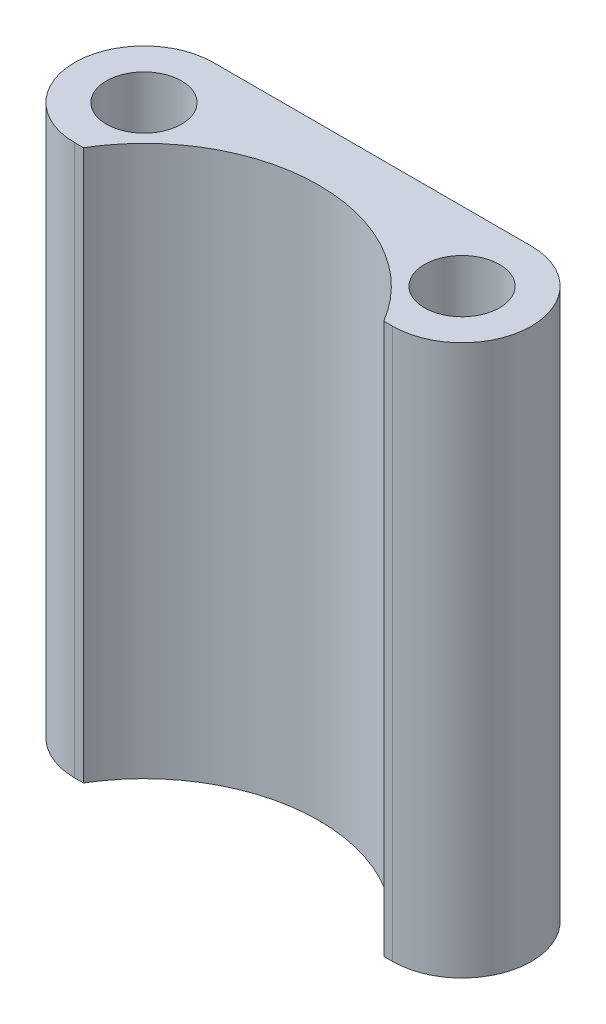
ISO-10303-21;
HEADER;
FILE_DESCRIPTION(('STEP AP214'),'2;1');
FILE_NAME('part.step','',(''),(''),'','','');
FILE_SCHEMA(('AUTOMOTIVE_DESIGN { 1 0 10303 214 1 1 1 1 }'));
ENDSEC;
DATA;
#1=APPLICATION_CONTEXT('core data for automotive mechanical design processes');
#2=APPLICATION_PROTOCOL_DEFINITION('international standard','automotive_design',2000,#1);
#3=PRODUCT_CONTEXT('',#1,'mechanical');
#4=PRODUCT('Part','Part','',(#3));
#5=PRODUCT_RELATED_PRODUCT_CATEGORY('part','',(#4));
#6=PRODUCT_DEFINITION_FORMATION('','',#4);
#7=PRODUCT_DEFINITION_CONTEXT('part definition',#1,'design');
#8=PRODUCT_DEFINITION('design','',#6,#7);
#9=PRODUCT_DEFINITION_SHAPE('','',#8);
#10=(LENGTH_UNIT() NAMED_UNIT(*) SI_UNIT(.MILLI.,.METRE.));
#11=(NAMED_UNIT(*) PLANE_ANGLE_UNIT() SI_UNIT($,.RADIAN.));
#12=(NAMED_UNIT(*) SI_UNIT($,.STERADIAN.) SOLID_ANGLE_UNIT());
#13=UNCERTAINTY_MEASURE_WITH_UNIT(LENGTH_MEASURE(1.E-05),#10,'distance_accuracy_value','');
#14=(GEOMETRIC_REPRESENTATION_CONTEXT(3) GLOBAL_UNCERTAINTY_ASSIGNED_CONTEXT((#13)) GLOBAL_UNIT_ASSIGNED_CONTEXT((#10,
#11,#12)) REPRESENTATION_CONTEXT('',''));
#15=CARTESIAN_POINT('',(0.,0.,0.));
#16=DIRECTION('',(0.,0.,1.));
#17=DIRECTION('',(1.,0.,0.));
#18=AXIS2_PLACEMENT_3D('',#15,#16,#17);
#19=CARTESIAN_POINT('',(0.,43.942,5.54));
#20=DIRECTION('',(0.,0.,-1.));
#21=DIRECTION('',(-1.,0.,0.));
#22=AXIS2_PLACEMENT_3D('',#19,#20,#21);
#23=PLANE('',#22);
#24=DIRECTION('',(1.,0.,0.));
#25=VECTOR('',#24,1.);
#26=CARTESIAN_POINT('',(0.,0.,5.54));
#27=LINE('',#26,#25);
#28=CARTESIAN_POINT('',(-12.7,0.,5.54));
#29=VERTEX_POINT('',#28);
#30=CARTESIAN_POINT('',(-11.9956367066318,0.,5.54));
#31=VERTEX_POINT('',#30);
#32=EDGE_CURVE('E129',#29,#31,#27,.T.);
#33=ORIENTED_EDGE('',*,*,#32,.T.);
#34=DIRECTION('',(0.,-1.,0.));
#35=VECTOR('',#34,1.);
#36=CARTESIAN_POINT('',(-11.9956367066318,43.942,5.54));
#37=LINE('',#36,#35);
#38=CARTESIAN_POINT('',(-11.9956367066318,43.942,5.54));
#39=VERTEX_POINT('',#38);
#40=EDGE_CURVE('E11',#39,#31,#37,.T.);
#41=ORIENTED_EDGE('',*,*,#40,.F.);
#42=DIRECTION('',(1.,0.,0.));
#43=VECTOR('',#42,1.);
#44=CARTESIAN_POINT('',(0.,43.942,5.54));
#45=LINE('',#44,#43);
#46=CARTESIAN_POINT('',(-12.7,43.942,5.54));
#47=VERTEX_POINT('',#46);
#48=EDGE_CURVE('E86',#47,#39,#45,.T.);
#49=ORIENTED_EDGE('',*,*,#48,.F.);
#50=DIRECTION('',(0.,-1.,0.));
#51=VECTOR('',#50,1.);
#52=CARTESIAN_POINT('',(-12.7,43.942,5.54));
#53=LINE('',#52,#51);
#54=EDGE_CURVE('E128',#47,#29,#53,.T.);
#55=ORIENTED_EDGE('',*,*,#54,.T.);
#56=EDGE_LOOP('',(#33,#41,#49,#55));
#57=FACE_BOUND('',#56,.T.);
#58=ADVANCED_FACE('F39',(#57),#23,.F.);
#59=CARTESIAN_POINT('',(1.044590437643E-10,43.942,12.7000000000001));
#60=DIRECTION('',(0.,-1.,0.));
#61=DIRECTION('',(0.,0.,-1.));
#62=AXIS2_PLACEMENT_3D('',#59,#60,#61);
#63=CYLINDRICAL_SURFACE('',#62,13.97);
#64=CARTESIAN_POINT('',(1.044590437643E-10,0.,12.7000000000001));
#65=DIRECTION('',(0.,1.,0.));
#66=DIRECTION('',(0.,0.,1.));
#67=AXIS2_PLACEMENT_3D('',#64,#65,#66);
#68=CIRCLE('',#67,13.97);
#69=CARTESIAN_POINT('',(11.9956367068407,0.,5.54));
#70=VERTEX_POINT('',#69);
#71=EDGE_CURVE('E132',#70,#31,#68,.T.);
#72=ORIENTED_EDGE('',*,*,#71,.F.);
#73=DIRECTION('',(0.,-1.,0.));
#74=VECTOR('',#73,1.);
#75=CARTESIAN_POINT('',(11.9956367068407,43.942,5.54));
#76=LINE('',#75,#74);
#77=CARTESIAN_POINT('',(11.9956367068407,43.942,5.54));
#78=VERTEX_POINT('',#77);
#79=EDGE_CURVE('E48',#78,#70,#76,.T.);
#80=ORIENTED_EDGE('',*,*,#79,.F.);
#81=CARTESIAN_POINT('',(1.044590437643E-10,43.942,12.7000000000001));
#82=DIRECTION('',(0.,1.,0.));
#83=DIRECTION('',(0.,0.,1.));
#84=AXIS2_PLACEMENT_3D('',#81,#82,#83);
#85=CIRCLE('',#84,13.97);
#86=EDGE_CURVE('E158',#78,#39,#85,.T.);
#87=ORIENTED_EDGE('',*,*,#86,.T.);
#88=ORIENTED_EDGE('',*,*,#40,.T.);
#89=EDGE_LOOP('',(#72,#80,#87,#88));
#90=FACE_BOUND('',#89,.T.);
#91=ADVANCED_FACE('F41',(#90),#63,.F.);
#92=CARTESIAN_POINT('',(12.7,0.,5.54));
#93=VERTEX_POINT('',#92);
#94=EDGE_CURVE('E133',#70,#93,#27,.T.);
#95=ORIENTED_EDGE('',*,*,#94,.T.);
#96=DIRECTION('',(0.,-1.,0.));
#97=VECTOR('',#96,1.);
#98=CARTESIAN_POINT('',(12.7,43.942,5.54));
#99=LINE('',#98,#97);
#100=CARTESIAN_POINT('',(12.7,43.942,5.54));
#101=VERTEX_POINT('',#100);
#102=EDGE_CURVE('E115',#101,#93,#99,.T.);
#103=ORIENTED_EDGE('',*,*,#102,.F.);
#104=EDGE_CURVE('E102',#78,#101,#45,.T.);
#105=ORIENTED_EDGE('',*,*,#104,.F.);
#106=ORIENTED_EDGE('',*,*,#79,.T.);
#107=EDGE_LOOP('',(#95,#103,#105,#106));
#108=FACE_BOUND('',#107,.T.);
#109=ADVANCED_FACE('F150',(#108),#23,.F.);
#110=CARTESIAN_POINT('',(12.7,43.942,0.));
#111=DIRECTION('',(0.,-1.,0.));
#112=DIRECTION('',(0.,0.,-1.));
#113=AXIS2_PLACEMENT_3D('',#110,#111,#112);
#114=CYLINDRICAL_SURFACE('',#113,5.54);
#115=CARTESIAN_POINT('',(12.7,0.,0.));
#116=DIRECTION('',(0.,1.,0.));
#117=DIRECTION('',(0.,0.,1.));
#118=AXIS2_PLACEMENT_3D('',#115,#116,#117);
#119=CIRCLE('',#118,5.54);
#120=CARTESIAN_POINT('',(12.7,0.,-5.54000000000001));
#121=VERTEX_POINT('',#120);
#122=EDGE_CURVE('E111',#93,#121,#119,.T.);
#123=ORIENTED_EDGE('',*,*,#122,.T.);
#124=DIRECTION('',(0.,-1.,0.));
#125=VECTOR('',#124,1.);
#126=CARTESIAN_POINT('',(12.7,43.942,-5.54000000000001));
#127=LINE('',#126,#125);
#128=CARTESIAN_POINT('',(12.7,43.942,-5.54000000000001));
#129=VERTEX_POINT('',#128);
#130=EDGE_CURVE('E108',#129,#121,#127,.T.);
#131=ORIENTED_EDGE('',*,*,#130,.F.);
#132=CARTESIAN_POINT('',(12.7,43.942,0.));
#133=DIRECTION('',(0.,1.,0.));
#134=DIRECTION('',(0.,0.,1.));
#135=AXIS2_PLACEMENT_3D('',#132,#133,#134);
#136=CIRCLE('',#135,5.54);
#137=EDGE_CURVE('E95',#101,#129,#136,.T.);
#138=ORIENTED_EDGE('',*,*,#137,.F.);
#139=ORIENTED_EDGE('',*,*,#102,.T.);
#140=EDGE_LOOP('',(#123,#131,#138,#139));
#141=FACE_BOUND('',#140,.T.);
#142=ADVANCED_FACE('F109',(#141),#114,.T.);
#143=CARTESIAN_POINT('',(0.,43.942,-5.54000000000001));
#144=DIRECTION('',(0.,0.,-1.));
#145=DIRECTION('',(-1.,0.,0.));
#146=AXIS2_PLACEMENT_3D('',#143,#144,#145);
#147=PLANE('',#146);
#148=DIRECTION('',(1.,0.,0.));
#149=VECTOR('',#148,1.);
#150=CARTESIAN_POINT('',(0.,0.,-5.54000000000001));
#151=LINE('',#150,#149);
#152=CARTESIAN_POINT('',(-12.7,0.,-5.54));
#153=VERTEX_POINT('',#152);
#154=EDGE_CURVE('E137',#153,#121,#151,.T.);
#155=ORIENTED_EDGE('',*,*,#154,.F.);
#156=DIRECTION('',(0.,-1.,0.));
#157=VECTOR('',#156,1.);
#158=CARTESIAN_POINT('',(-12.7,43.942,-5.54));
#159=LINE('',#158,#157);
#160=CARTESIAN_POINT('',(-12.7,43.942,-5.54));
#161=VERTEX_POINT('',#160);
#162=EDGE_CURVE('E77',#161,#153,#159,.T.);
#163=ORIENTED_EDGE('',*,*,#162,.F.);
#164=DIRECTION('',(1.,0.,0.));
#165=VECTOR('',#164,1.);
#166=CARTESIAN_POINT('',(0.,43.942,-5.54000000000001));
#167=LINE('',#166,#165);
#168=EDGE_CURVE('E100',#161,#129,#167,.T.);
#169=ORIENTED_EDGE('',*,*,#168,.T.);
#170=ORIENTED_EDGE('',*,*,#130,.T.);
#171=EDGE_LOOP('',(#155,#163,#169,#170));
#172=FACE_BOUND('',#171,.T.);
#173=ADVANCED_FACE('F117',(#172),#147,.T.);
#174=CARTESIAN_POINT('',(12.7,43.942,0.));
#175=DIRECTION('',(0.,-1.,0.));
#176=DIRECTION('',(0.,0.,-1.));
#177=AXIS2_PLACEMENT_3D('',#174,#175,#176);
#178=CYLINDRICAL_SURFACE('',#177,3.);
#179=CARTESIAN_POINT('',(12.7,43.942,0.));
#180=DIRECTION('',(0.,1.,0.));
#181=DIRECTION('',(0.,0.,1.));
#182=AXIS2_PLACEMENT_3D('',#179,#180,#181);
#183=CIRCLE('',#182,3.);
#184=CARTESIAN_POINT('',(12.7,43.942,-3.));
#185=VERTEX_POINT('',#184);
#186=EDGE_CURVE('E119',#185,#185,#183,.T.);
#187=CARTESIAN_POINT('',(12.7,0.,0.));
#188=DIRECTION('',(0.,1.,0.));
#189=DIRECTION('',(0.,0.,1.));
#190=AXIS2_PLACEMENT_3D('',#187,#188,#189);
#191=CIRCLE('',#190,3.);
#192=CARTESIAN_POINT('',(12.7,0.,-3.));
#193=VERTEX_POINT('',#192);
#194=EDGE_CURVE('E140',#193,#193,#191,.T.);
#195=CARTESIAN_POINT('',(12.7,43.942,-3.));
#196=CARTESIAN_POINT('',(12.7,43.4842708333333,-3.));
#197=CARTESIAN_POINT('',(12.7,43.0265416666667,-3.));
#198=CARTESIAN_POINT('',(12.7,42.1110833333333,-3.));
#199=CARTESIAN_POINT('',(12.7,41.6533541666667,-3.));
#200=CARTESIAN_POINT('',(12.7,40.7378958333333,-3.));
#201=CARTESIAN_POINT('',(12.7,40.2801666666667,-3.));
#202=CARTESIAN_POINT('',(12.7,39.3647083333333,-3.));
#203=CARTESIAN_POINT('',(12.7,38.9069791666667,-3.));
#204=CARTESIAN_POINT('',(12.7,37.9915208333333,-3.));
#205=CARTESIAN_POINT('',(12.7,37.5337916666667,-3.));
#206=CARTESIAN_POINT('',(12.7,36.6183333333333,-3.));
#207=CARTESIAN_POINT('',(12.7,36.1606041666667,-3.));
#208=CARTESIAN_POINT('',(12.7,35.2451458333333,-3.));
#209=CARTESIAN_POINT('',(12.7,34.7874166666667,-3.));
#210=CARTESIAN_POINT('',(12.7,33.8719583333333,-3.));
#211=CARTESIAN_POINT('',(12.7,33.4142291666667,-3.));
#212=CARTESIAN_POINT('',(12.7,32.4987708333333,-3.));
#213=CARTESIAN_POINT('',(12.7,32.0410416666667,-3.));
#214=CARTESIAN_POINT('',(12.7,31.1255833333333,-3.));
#215=CARTESIAN_POINT('',(12.7,30.6678541666667,-3.));
#216=CARTESIAN_POINT('',(12.7,29.7523958333333,-3.));
#217=CARTESIAN_POINT('',(12.7,29.2946666666667,-3.));
#218=CARTESIAN_POINT('',(12.7,28.3792083333333,-3.));
#219=CARTESIAN_POINT('',(12.7,27.9214791666667,-3.));
#220=CARTESIAN_POINT('',(12.7,27.0060208333333,-3.));
#221=CARTESIAN_POINT('',(12.7,26.5482916666667,-3.));
#222=CARTESIAN_POINT('',(12.7,25.6328333333333,-3.));
#223=CARTESIAN_POINT('',(12.7,25.1751041666667,-3.));
#224=CARTESIAN_POINT('',(12.7,24.2596458333333,-3.));
#225=CARTESIAN_POINT('',(12.7,23.8019166666667,-3.));
#226=CARTESIAN_POINT('',(12.7,22.8864583333333,-3.));
#227=CARTESIAN_POINT('',(12.7,22.4287291666667,-3.));
#228=CARTESIAN_POINT('',(12.7,21.5132708333333,-3.));
#229=CARTESIAN_POINT('',(12.7,21.0555416666667,-3.));
#230=CARTESIAN_POINT('',(12.7,20.1400833333333,-3.));
#231=CARTESIAN_POINT('',(12.7,19.6823541666667,-3.));
#232=CARTESIAN_POINT('',(12.7,18.7668958333333,-3.));
#233=CARTESIAN_POINT('',(12.7,18.3091666666667,-3.));
#234=CARTESIAN_POINT('',(12.7,17.3937083333333,-3.));
#235=CARTESIAN_POINT('',(12.7,16.9359791666667,-3.));
#236=CARTESIAN_POINT('',(12.7,16.0205208333333,-3.));
#237=CARTESIAN_POINT('',(12.7,15.5627916666667,-3.));
#238=CARTESIAN_POINT('',(12.7,14.6473333333333,-3.));
#239=CARTESIAN_POINT('',(12.7,14.1896041666667,-3.));
#240=CARTESIAN_POINT('',(12.7,13.2741458333333,-3.));
#241=CARTESIAN_POINT('',(12.7,12.8164166666667,-3.));
#242=CARTESIAN_POINT('',(12.7,11.9009583333333,-3.));
#243=CARTESIAN_POINT('',(12.7,11.4432291666667,-3.));
#244=CARTESIAN_POINT('',(12.7,10.5277708333333,-3.));
#245=CARTESIAN_POINT('',(12.7,10.0700416666667,-3.));
#246=CARTESIAN_POINT('',(12.7,9.15458333333333,-3.));
#247=CARTESIAN_POINT('',(12.7,8.69685416666666,-3.));
#248=CARTESIAN_POINT('',(12.7,7.78139583333333,-3.));
#249=CARTESIAN_POINT('',(12.7,7.32366666666666,-3.));
#250=CARTESIAN_POINT('',(12.7,6.40820833333333,-3.));
#251=CARTESIAN_POINT('',(12.7,5.95047916666666,-3.));
#252=CARTESIAN_POINT('',(12.7,5.03502083333332,-3.));
#253=CARTESIAN_POINT('',(12.7,4.57729166666666,-3.));
#254=CARTESIAN_POINT('',(12.7,3.66183333333333,-3.));
#255=CARTESIAN_POINT('',(12.7,3.20410416666666,-3.));
#256=CARTESIAN_POINT('',(12.7,2.28864583333333,-3.));
#257=CARTESIAN_POINT('',(12.7,1.83091666666666,-3.));
#258=CARTESIAN_POINT('',(12.7,0.915458333333325,-3.));
#259=CARTESIAN_POINT('',(12.7,0.457729166666659,-3.));
#260=CARTESIAN_POINT('',(12.7,0.,-3.));
#261=B_SPLINE_CURVE_WITH_KNOTS('',3,(#195,#196,#197,#198,#199,#200,#201,#202,#203,#204,#205,
#206,#207,#208,#209,#210,#211,#212,#213,#214,#215,#216,#217,#218,#219,#220,#221,#222,#223,#224,
#225,#226,#227,#228,#229,#230,#231,#232,#233,#234,#235,#236,#237,#238,#239,#240,#241,#242,#243,
#244,#245,#246,#247,#248,#249,#250,#251,#252,#253,#254,#255,#256,#257,#258,#259,#260),
.UNSPECIFIED.,.F.,.F.,(4,2,2,2,2,2,2,2,2,2,2,2,2,2,2,2,2,2,2,2,2,2,2,2,2,2,2,2,2,2,2,2,4),(0.,
1.3731875,2.746375,4.11956249999999,5.49275,6.86593749999999,8.23912499999999,9.6123125,10.9855,
12.3586875,13.731875,15.1050625,16.47825,17.8514375,19.224625,20.5978125,21.971,23.3441875,
24.717375,26.0905625,27.46375,28.8369375,30.210125,31.5833125,32.9565,34.3296875,35.702875,
37.0760625,38.44925,39.8224375,41.195625,42.5688125,43.942),.UNSPECIFIED.);
#262=EDGE_CURVE('BSEAM163',#185,#193,#261,.T.);
#263=ORIENTED_EDGE('',*,*,#186,.T.);
#264=ORIENTED_EDGE('',*,*,#194,.F.);
#265=ORIENTED_EDGE('',*,*,#262,.T.);
#266=ORIENTED_EDGE('',*,*,#262,.F.);
#267=EDGE_LOOP('',(#263,#265,#264,#266));
#268=FACE_BOUND('',#267,.T.);
#269=ADVANCED_FACE('F163',(#268),#178,.F.);
#270=CARTESIAN_POINT('',(-12.7,43.942,0.));
#271=DIRECTION('',(0.,-1.,0.));
#272=DIRECTION('',(0.,0.,-1.));
#273=AXIS2_PLACEMENT_3D('',#270,#271,#272);
#274=CYLINDRICAL_SURFACE('',#273,5.54);
#275=CARTESIAN_POINT('',(-12.7,0.,0.));
#276=DIRECTION('',(0.,1.,0.));
#277=DIRECTION('',(0.,0.,1.));
#278=AXIS2_PLACEMENT_3D('',#275,#276,#277);
#279=CIRCLE('',#278,5.54);
#280=EDGE_CURVE('E80',#153,#29,#279,.T.);
#281=ORIENTED_EDGE('',*,*,#280,.T.);
#282=ORIENTED_EDGE('',*,*,#54,.F.);
#283=CARTESIAN_POINT('',(-12.7,43.942,0.));
#284=DIRECTION('',(0.,1.,0.));
#285=DIRECTION('',(0.,0.,1.));
#286=AXIS2_PLACEMENT_3D('',#283,#284,#285);
#287=CIRCLE('',#286,5.54);
#288=EDGE_CURVE('E56',#161,#47,#287,.T.);
#289=ORIENTED_EDGE('',*,*,#288,.F.);
#290=ORIENTED_EDGE('',*,*,#162,.T.);
#291=EDGE_LOOP('',(#281,#282,#289,#290));
#292=FACE_BOUND('',#291,.T.);
#293=ADVANCED_FACE('F160',(#292),#274,.T.);
#294=CARTESIAN_POINT('',(-12.7,43.942,0.));
#295=DIRECTION('',(0.,-1.,0.));
#296=DIRECTION('',(0.,0.,-1.));
#297=AXIS2_PLACEMENT_3D('',#294,#295,#296);
#298=CYLINDRICAL_SURFACE('',#297,2.99999999999999);
#299=CARTESIAN_POINT('',(-12.7,43.942,0.));
#300=DIRECTION('',(0.,1.,0.));
#301=DIRECTION('',(0.,0.,1.));
#302=AXIS2_PLACEMENT_3D('',#299,#300,#301);
#303=CIRCLE('',#302,2.99999999999999);
#304=CARTESIAN_POINT('',(-12.7,43.942,-2.99999999999999));
#305=VERTEX_POINT('',#304);
#306=EDGE_CURVE('E125',#305,#305,#303,.T.);
#307=CARTESIAN_POINT('',(-12.7,0.,0.));
#308=DIRECTION('',(0.,1.,0.));
#309=DIRECTION('',(0.,0.,1.));
#310=AXIS2_PLACEMENT_3D('',#307,#308,#309);
#311=CIRCLE('',#310,2.99999999999999);
#312=CARTESIAN_POINT('',(-12.7,0.,-2.99999999999999));
#313=VERTEX_POINT('',#312);
#314=EDGE_CURVE('E143',#313,#313,#311,.T.);
#315=CARTESIAN_POINT('',(-12.7,43.942,-2.99999999999999));
#316=CARTESIAN_POINT('',(-12.7,43.4842708333333,-2.99999999999999));
#317=CARTESIAN_POINT('',(-12.7,43.0265416666667,-2.99999999999999));
#318=CARTESIAN_POINT('',(-12.7,42.1110833333333,-2.99999999999999));
#319=CARTESIAN_POINT('',(-12.7,41.6533541666667,-2.99999999999999));
#320=CARTESIAN_POINT('',(-12.7,40.7378958333333,-2.99999999999999));
#321=CARTESIAN_POINT('',(-12.7,40.2801666666667,-2.99999999999999));
#322=CARTESIAN_POINT('',(-12.7,39.3647083333333,-2.99999999999999));
#323=CARTESIAN_POINT('',(-12.7,38.9069791666667,-2.99999999999999));
#324=CARTESIAN_POINT('',(-12.7,37.9915208333333,-2.99999999999999));
#325=CARTESIAN_POINT('',(-12.7,37.5337916666667,-2.99999999999999));
#326=CARTESIAN_POINT('',(-12.7,36.6183333333333,-2.99999999999999));
#327=CARTESIAN_POINT('',(-12.7,36.1606041666667,-2.99999999999999));
#328=CARTESIAN_POINT('',(-12.7,35.2451458333333,-2.99999999999999));
#329=CARTESIAN_POINT('',(-12.7,34.7874166666667,-2.99999999999999));
#330=CARTESIAN_POINT('',(-12.7,33.8719583333333,-2.99999999999999));
#331=CARTESIAN_POINT('',(-12.7,33.4142291666667,-2.99999999999999));
#332=CARTESIAN_POINT('',(-12.7,32.4987708333333,-2.99999999999999));
#333=CARTESIAN_POINT('',(-12.7,32.0410416666667,-2.99999999999999));
#334=CARTESIAN_POINT('',(-12.7,31.1255833333333,-2.99999999999999));
#335=CARTESIAN_POINT('',(-12.7,30.6678541666667,-2.99999999999999));
#336=CARTESIAN_POINT('',(-12.7,29.7523958333333,-2.99999999999999));
#337=CARTESIAN_POINT('',(-12.7,29.2946666666667,-2.99999999999999));
#338=CARTESIAN_POINT('',(-12.7,28.3792083333333,-2.99999999999999));
#339=CARTESIAN_POINT('',(-12.7,27.9214791666667,-2.99999999999999));
#340=CARTESIAN_POINT('',(-12.7,27.0060208333333,-2.99999999999999));
#341=CARTESIAN_POINT('',(-12.7,26.5482916666667,-2.99999999999999));
#342=CARTESIAN_POINT('',(-12.7,25.6328333333333,-2.99999999999999));
#343=CARTESIAN_POINT('',(-12.7,25.1751041666667,-2.99999999999999));
#344=CARTESIAN_POINT('',(-12.7,24.2596458333333,-2.99999999999999));
#345=CARTESIAN_POINT('',(-12.7,23.8019166666667,-2.99999999999999));
#346=CARTESIAN_POINT('',(-12.7,22.8864583333333,-2.99999999999999));
#347=CARTESIAN_POINT('',(-12.7,22.4287291666667,-2.99999999999999));
#348=CARTESIAN_POINT('',(-12.7,21.5132708333333,-2.99999999999999));
#349=CARTESIAN_POINT('',(-12.7,21.0555416666667,-2.99999999999999));
#350=CARTESIAN_POINT('',(-12.7,20.1400833333333,-2.99999999999999));
#351=CARTESIAN_POINT('',(-12.7,19.6823541666667,-2.99999999999999));
#352=CARTESIAN_POINT('',(-12.7,18.7668958333333,-2.99999999999999));
#353=CARTESIAN_POINT('',(-12.7,18.3091666666667,-2.99999999999999));
#354=CARTESIAN_POINT('',(-12.7,17.3937083333333,-2.99999999999999));
#355=CARTESIAN_POINT('',(-12.7,16.9359791666667,-2.99999999999999));
#356=CARTESIAN_POINT('',(-12.7,16.0205208333333,-2.99999999999999));
#357=CARTESIAN_POINT('',(-12.7,15.5627916666667,-2.99999999999999));
#358=CARTESIAN_POINT('',(-12.7,14.6473333333333,-2.99999999999999));
#359=CARTESIAN_POINT('',(-12.7,14.1896041666667,-2.99999999999999));
#360=CARTESIAN_POINT('',(-12.7,13.2741458333333,-2.99999999999999));
#361=CARTESIAN_POINT('',(-12.7,12.8164166666667,-2.99999999999999));
#362=CARTESIAN_POINT('',(-12.7,11.9009583333333,-2.99999999999999));
#363=CARTESIAN_POINT('',(-12.7,11.4432291666667,-2.99999999999999));
#364=CARTESIAN_POINT('',(-12.7,10.5277708333333,-2.99999999999999));
#365=CARTESIAN_POINT('',(-12.7,10.0700416666667,-2.99999999999999));
#366=CARTESIAN_POINT('',(-12.7,9.15458333333333,-2.99999999999999));
#367=CARTESIAN_POINT('',(-12.7,8.69685416666666,-2.99999999999999));
#368=CARTESIAN_POINT('',(-12.7,7.78139583333333,-2.99999999999999));
#369=CARTESIAN_POINT('',(-12.7,7.32366666666666,-2.99999999999999));
#370=CARTESIAN_POINT('',(-12.7,6.40820833333333,-2.99999999999999));
#371=CARTESIAN_POINT('',(-12.7,5.95047916666666,-2.99999999999999));
#372=CARTESIAN_POINT('',(-12.7,5.03502083333332,-2.99999999999999));
#373=CARTESIAN_POINT('',(-12.7,4.57729166666666,-2.99999999999999));
#374=CARTESIAN_POINT('',(-12.7,3.66183333333333,-2.99999999999999));
#375=CARTESIAN_POINT('',(-12.7,3.20410416666666,-2.99999999999999));
#376=CARTESIAN_POINT('',(-12.7,2.28864583333333,-2.99999999999999));
#377=CARTESIAN_POINT('',(-12.7,1.83091666666666,-2.99999999999999));
#378=CARTESIAN_POINT('',(-12.7,0.915458333333325,-2.99999999999999));
#379=CARTESIAN_POINT('',(-12.7,0.457729166666659,-2.99999999999999));
#380=CARTESIAN_POINT('',(-12.7,0.,-2.99999999999999));
#381=B_SPLINE_CURVE_WITH_KNOTS('',3,(#315,#316,#317,#318,#319,#320,#321,#322,#323,#324,#325,
#326,#327,#328,#329,#330,#331,#332,#333,#334,#335,#336,#337,#338,#339,#340,#341,#342,#343,#344,
#345,#346,#347,#348,#349,#350,#351,#352,#353,#354,#355,#356,#357,#358,#359,#360,#361,#362,#363,
#364,#365,#366,#367,#368,#369,#370,#371,#372,#373,#374,#375,#376,#377,#378,#379,#380),
.UNSPECIFIED.,.F.,.F.,(4,2,2,2,2,2,2,2,2,2,2,2,2,2,2,2,2,2,2,2,2,2,2,2,2,2,2,2,2,2,2,2,4),(0.,
1.3731875,2.746375,4.11956249999999,5.49275,6.86593749999999,8.23912499999999,9.6123125,10.9855,
12.3586875,13.731875,15.1050625,16.47825,17.8514375,19.224625,20.5978125,21.971,23.3441875,
24.717375,26.0905625,27.46375,28.8369375,30.210125,31.5833125,32.9565,34.3296875,35.702875,
37.0760625,38.44925,39.8224375,41.195625,42.5688125,43.942),.UNSPECIFIED.);
#382=EDGE_CURVE('BSEAM162',#305,#313,#381,.T.);
#383=ORIENTED_EDGE('',*,*,#306,.T.);
#384=ORIENTED_EDGE('',*,*,#314,.F.);
#385=ORIENTED_EDGE('',*,*,#382,.T.);
#386=ORIENTED_EDGE('',*,*,#382,.F.);
#387=EDGE_LOOP('',(#383,#385,#384,#386));
#388=FACE_BOUND('',#387,.T.);
#389=ADVANCED_FACE('F162',(#388),#298,.F.);
#390=CARTESIAN_POINT('',(0.,43.942,0.));
#391=DIRECTION('',(0.,1.,0.));
#392=DIRECTION('',(0.,0.,1.));
#393=AXIS2_PLACEMENT_3D('',#390,#391,#392);
#394=PLANE('',#393);
#395=ORIENTED_EDGE('',*,*,#48,.T.);
#396=ORIENTED_EDGE('',*,*,#86,.F.);
#397=ORIENTED_EDGE('',*,*,#104,.T.);
#398=ORIENTED_EDGE('',*,*,#137,.T.);
#399=ORIENTED_EDGE('',*,*,#168,.F.);
#400=ORIENTED_EDGE('',*,*,#288,.T.);
#401=EDGE_LOOP('',(#395,#396,#397,#398,#399,#400));
#402=FACE_BOUND('',#401,.T.);
#403=ORIENTED_EDGE('',*,*,#186,.F.);
#404=EDGE_LOOP('',(#403));
#405=FACE_BOUND('',#404,.T.);
#406=ORIENTED_EDGE('',*,*,#306,.F.);
#407=EDGE_LOOP('',(#406));
#408=FACE_BOUND('',#407,.T.);
#409=ADVANCED_FACE('F97',(#402,#405,#408),#394,.T.);
#410=CARTESIAN_POINT('',(0.,0.,0.));
#411=DIRECTION('',(0.,1.,0.));
#412=DIRECTION('',(0.,0.,1.));
#413=AXIS2_PLACEMENT_3D('',#410,#411,#412);
#414=PLANE('',#413);
#415=ORIENTED_EDGE('',*,*,#32,.F.);
#416=ORIENTED_EDGE('',*,*,#280,.F.);
#417=ORIENTED_EDGE('',*,*,#154,.T.);
#418=ORIENTED_EDGE('',*,*,#122,.F.);
#419=ORIENTED_EDGE('',*,*,#94,.F.);
#420=ORIENTED_EDGE('',*,*,#71,.T.);
#421=EDGE_LOOP('',(#415,#416,#417,#418,#419,#420));
#422=FACE_BOUND('',#421,.T.);
#423=ORIENTED_EDGE('',*,*,#194,.T.);
#424=EDGE_LOOP('',(#423));
#425=FACE_BOUND('',#424,.T.);
#426=ORIENTED_EDGE('',*,*,#314,.T.);
#427=EDGE_LOOP('',(#426));
#428=FACE_BOUND('',#427,.T.);
#429=ADVANCED_FACE('F156',(#422,#425,#428),#414,.F.);
#430=CLOSED_SHELL('',(#58,#91,#109,#142,#173,#269,#293,#389,#409,#429));
#431=MANIFOLD_SOLID_BREP('B2',#430);
#432=ADVANCED_BREP_SHAPE_REPRESENTATION('',(#18,#431),#14);
#433=SHAPE_DEFINITION_REPRESENTATION(#9,#432);
ENDSEC;
END-ISO-10303-21;
